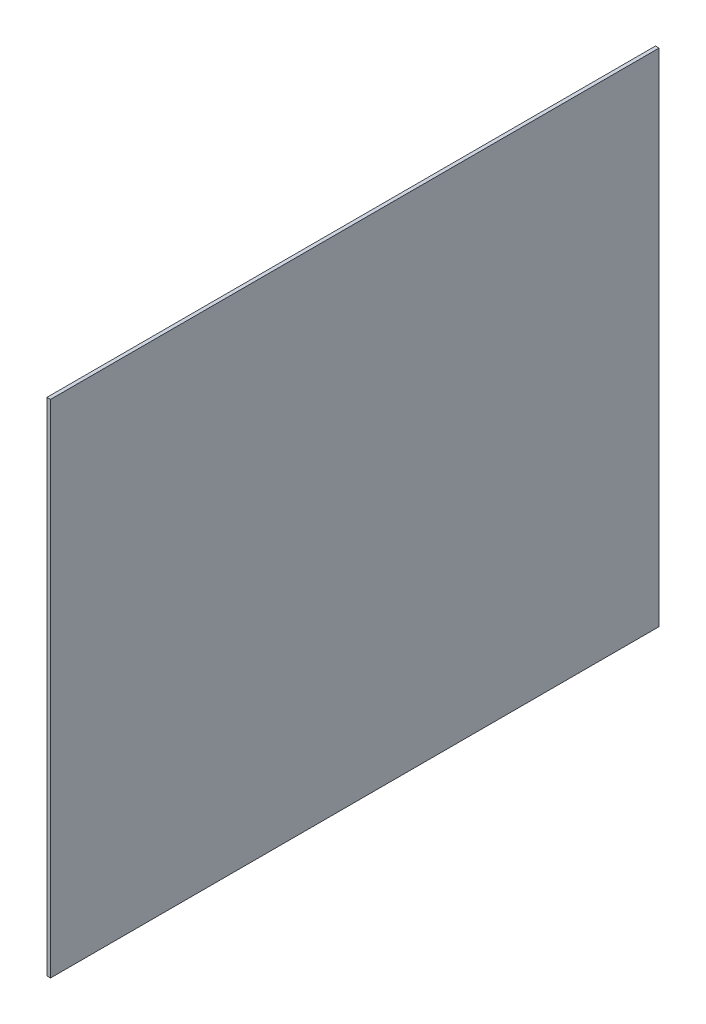
ISO-10303-21;
HEADER;
FILE_DESCRIPTION(('STEP AP214'),'2;1');
FILE_NAME('part.step','',(''),(''),'','','');
FILE_SCHEMA(('AUTOMOTIVE_DESIGN { 1 0 10303 214 1 1 1 1 }'));
ENDSEC;
DATA;
#1=APPLICATION_CONTEXT('core data for automotive mechanical design processes');
#2=APPLICATION_PROTOCOL_DEFINITION('international standard','automotive_design',2000,#1);
#3=PRODUCT_CONTEXT('',#1,'mechanical');
#4=PRODUCT('Part','Part','',(#3));
#5=PRODUCT_RELATED_PRODUCT_CATEGORY('part','',(#4));
#6=PRODUCT_DEFINITION_FORMATION('','',#4);
#7=PRODUCT_DEFINITION_CONTEXT('part definition',#1,'design');
#8=PRODUCT_DEFINITION('design','',#6,#7);
#9=PRODUCT_DEFINITION_SHAPE('','',#8);
#10=(LENGTH_UNIT() NAMED_UNIT(*) SI_UNIT(.MILLI.,.METRE.));
#11=(NAMED_UNIT(*) PLANE_ANGLE_UNIT() SI_UNIT($,.RADIAN.));
#12=(NAMED_UNIT(*) SI_UNIT($,.STERADIAN.) SOLID_ANGLE_UNIT());
#13=UNCERTAINTY_MEASURE_WITH_UNIT(LENGTH_MEASURE(1.E-05),#10,'distance_accuracy_value','');
#14=(GEOMETRIC_REPRESENTATION_CONTEXT(3) GLOBAL_UNCERTAINTY_ASSIGNED_CONTEXT((#13)) GLOBAL_UNIT_ASSIGNED_CONTEXT((#10,
#11,#12)) REPRESENTATION_CONTEXT('',''));
#15=CARTESIAN_POINT('',(0.,0.,0.));
#16=DIRECTION('',(0.,0.,1.));
#17=DIRECTION('',(1.,0.,0.));
#18=AXIS2_PLACEMENT_3D('',#15,#16,#17);
#19=CARTESIAN_POINT('',(370.,1410.,-120.));
#20=DIRECTION('',(0.,0.,1.));
#21=DIRECTION('',(0.,1.,0.));
#22=AXIS2_PLACEMENT_3D('',#19,#20,#21);
#23=PLANE('',#22);
#24=DIRECTION('',(0.,-1.,0.));
#25=VECTOR('',#24,1.);
#26=CARTESIAN_POINT('',(372.,1410.,-120.));
#27=LINE('',#26,#25);
#28=CARTESIAN_POINT('',(372.,1410.,-120.));
#29=VERTEX_POINT('',#28);
#30=CARTESIAN_POINT('',(372.,1130.,-120.));
#31=VERTEX_POINT('',#30);
#32=EDGE_CURVE('E227',#29,#31,#27,.T.);
#33=ORIENTED_EDGE('',*,*,#32,.T.);
#34=DIRECTION('',(1.,0.,0.));
#35=VECTOR('',#34,1.);
#36=CARTESIAN_POINT('',(370.,1130.,-120.));
#37=LINE('',#36,#35);
#38=CARTESIAN_POINT('',(370.,1130.,-120.));
#39=VERTEX_POINT('',#38);
#40=EDGE_CURVE('E11',#39,#31,#37,.T.);
#41=ORIENTED_EDGE('',*,*,#40,.F.);
#42=DIRECTION('',(0.,-1.,0.));
#43=VECTOR('',#42,1.);
#44=CARTESIAN_POINT('',(370.,1410.,-120.));
#45=LINE('',#44,#43);
#46=CARTESIAN_POINT('',(370.,1410.,-120.));
#47=VERTEX_POINT('',#46);
#48=EDGE_CURVE('E237',#47,#39,#45,.T.);
#49=ORIENTED_EDGE('',*,*,#48,.F.);
#50=DIRECTION('',(1.,0.,0.));
#51=VECTOR('',#50,1.);
#52=CARTESIAN_POINT('',(370.,1410.,-120.));
#53=LINE('',#52,#51);
#54=EDGE_CURVE('E246',#47,#29,#53,.T.);
#55=ORIENTED_EDGE('',*,*,#54,.T.);
#56=EDGE_LOOP('',(#33,#41,#49,#55));
#57=FACE_BOUND('',#56,.T.);
#58=ADVANCED_FACE('F17',(#57),#23,.F.);
#59=CARTESIAN_POINT('',(370.,1130.,-120.));
#60=DIRECTION('',(0.,1.,0.));
#61=DIRECTION('',(0.,0.,-1.));
#62=AXIS2_PLACEMENT_3D('',#59,#60,#61);
#63=PLANE('',#62);
#64=DIRECTION('',(0.,0.,1.));
#65=VECTOR('',#64,1.);
#66=CARTESIAN_POINT('',(372.,1130.,-120.));
#67=LINE('',#66,#65);
#68=CARTESIAN_POINT('',(372.,1130.,220.));
#69=VERTEX_POINT('',#68);
#70=EDGE_CURVE('E228',#31,#69,#67,.T.);
#71=ORIENTED_EDGE('',*,*,#70,.T.);
#72=DIRECTION('',(1.,0.,0.));
#73=VECTOR('',#72,1.);
#74=CARTESIAN_POINT('',(370.,1130.,220.));
#75=LINE('',#74,#73);
#76=CARTESIAN_POINT('',(370.,1130.,220.));
#77=VERTEX_POINT('',#76);
#78=EDGE_CURVE('E24',#77,#69,#75,.T.);
#79=ORIENTED_EDGE('',*,*,#78,.F.);
#80=DIRECTION('',(0.,0.,1.));
#81=VECTOR('',#80,1.);
#82=CARTESIAN_POINT('',(370.,1130.,-120.));
#83=LINE('',#82,#81);
#84=EDGE_CURVE('E240',#39,#77,#83,.T.);
#85=ORIENTED_EDGE('',*,*,#84,.F.);
#86=ORIENTED_EDGE('',*,*,#40,.T.);
#87=EDGE_LOOP('',(#71,#79,#85,#86));
#88=FACE_BOUND('',#87,.T.);
#89=ADVANCED_FACE('F272',(#88),#63,.F.);
#90=CARTESIAN_POINT('',(370.,1130.,220.));
#91=DIRECTION('',(0.,0.,-1.));
#92=DIRECTION('',(0.,-1.,0.));
#93=AXIS2_PLACEMENT_3D('',#90,#91,#92);
#94=PLANE('',#93);
#95=DIRECTION('',(0.,1.,0.));
#96=VECTOR('',#95,1.);
#97=CARTESIAN_POINT('',(372.,1130.,220.));
#98=LINE('',#97,#96);
#99=CARTESIAN_POINT('',(372.,1410.,220.));
#100=VERTEX_POINT('',#99);
#101=EDGE_CURVE('E233',#69,#100,#98,.T.);
#102=ORIENTED_EDGE('',*,*,#101,.T.);
#103=DIRECTION('',(1.,0.,0.));
#104=VECTOR('',#103,1.);
#105=CARTESIAN_POINT('',(370.,1410.,220.));
#106=LINE('',#105,#104);
#107=CARTESIAN_POINT('',(370.,1410.,220.));
#108=VERTEX_POINT('',#107);
#109=EDGE_CURVE('E251',#108,#100,#106,.T.);
#110=ORIENTED_EDGE('',*,*,#109,.F.);
#111=DIRECTION('',(0.,1.,0.));
#112=VECTOR('',#111,1.);
#113=CARTESIAN_POINT('',(370.,1130.,220.));
#114=LINE('',#113,#112);
#115=EDGE_CURVE('E242',#77,#108,#114,.T.);
#116=ORIENTED_EDGE('',*,*,#115,.F.);
#117=ORIENTED_EDGE('',*,*,#78,.T.);
#118=EDGE_LOOP('',(#102,#110,#116,#117));
#119=FACE_BOUND('',#118,.T.);
#120=ADVANCED_FACE('F258',(#119),#94,.F.);
#121=CARTESIAN_POINT('',(370.,1410.,220.));
#122=DIRECTION('',(0.,-1.,0.));
#123=DIRECTION('',(0.,0.,1.));
#124=AXIS2_PLACEMENT_3D('',#121,#122,#123);
#125=PLANE('',#124);
#126=DIRECTION('',(0.,0.,-1.));
#127=VECTOR('',#126,1.);
#128=CARTESIAN_POINT('',(372.,1410.,220.));
#129=LINE('',#128,#127);
#130=EDGE_CURVE('E235',#100,#29,#129,.T.);
#131=ORIENTED_EDGE('',*,*,#130,.T.);
#132=ORIENTED_EDGE('',*,*,#54,.F.);
#133=DIRECTION('',(0.,0.,-1.));
#134=VECTOR('',#133,1.);
#135=CARTESIAN_POINT('',(370.,1410.,220.));
#136=LINE('',#135,#134);
#137=EDGE_CURVE('E244',#108,#47,#136,.T.);
#138=ORIENTED_EDGE('',*,*,#137,.F.);
#139=ORIENTED_EDGE('',*,*,#109,.T.);
#140=EDGE_LOOP('',(#131,#132,#138,#139));
#141=FACE_BOUND('',#140,.T.);
#142=ADVANCED_FACE('F267',(#141),#125,.F.);
#143=CARTESIAN_POINT('',(370.,1130.,-120.));
#144=DIRECTION('',(-1.,0.,0.));
#145=DIRECTION('',(0.,-1.,0.));
#146=AXIS2_PLACEMENT_3D('',#143,#144,#145);
#147=PLANE('',#146);
#148=CARTESIAN_POINT('',(370.,1150.,-105.));
#149=CARTESIAN_POINT('',(370.,1150.,205.));
#150=B_SPLINE_CURVE_WITH_KNOTS('',1,(#148,#149),.UNSPECIFIED.,.F.,.F.,(2,2),(0.,
0.281818181818182),.UNSPECIFIED.);
#151=CARTESIAN_POINT('',(370.,1150.,-105.));
#152=VERTEX_POINT('',#151);
#153=CARTESIAN_POINT('',(370.,1150.,205.));
#154=VERTEX_POINT('',#153);
#155=EDGE_CURVE('E90',#152,#154,#150,.T.);
#156=ORIENTED_EDGE('',*,*,#155,.F.);
#157=CARTESIAN_POINT('',(370.,1385.71428571429,-105.));
#158=CARTESIAN_POINT('',(370.,1150.,-105.));
#159=B_SPLINE_CURVE_WITH_KNOTS('',1,(#157,#158),.UNSPECIFIED.,.F.,.F.,(2,2),(0.785714285714286,
1.),.UNSPECIFIED.);
#160=CARTESIAN_POINT('',(370.,1385.71428571429,-105.));
#161=VERTEX_POINT('',#160);
#162=EDGE_CURVE('E94',#161,#152,#159,.T.);
#163=ORIENTED_EDGE('',*,*,#162,.F.);
#164=CARTESIAN_POINT('',(370.,1390.,-105.));
#165=CARTESIAN_POINT('',(370.,1385.71428571429,-105.));
#166=B_SPLINE_CURVE_WITH_KNOTS('',1,(#164,#165),.UNSPECIFIED.,.F.,.F.,(2,2),(0.781818181818182,
0.785714285714286),.UNSPECIFIED.);
#167=CARTESIAN_POINT('',(370.,1390.,-105.));
#168=VERTEX_POINT('',#167);
#169=EDGE_CURVE('E115',#168,#161,#166,.T.);
#170=ORIENTED_EDGE('',*,*,#169,.F.);
#171=CARTESIAN_POINT('',(370.,1390.,205.));
#172=CARTESIAN_POINT('',(370.,1390.,-105.));
#173=B_SPLINE_CURVE_WITH_KNOTS('',1,(#171,#172),.UNSPECIFIED.,.F.,.F.,(2,2),(0.5,
0.781818181818182),.UNSPECIFIED.);
#174=CARTESIAN_POINT('',(370.,1390.,205.));
#175=VERTEX_POINT('',#174);
#176=EDGE_CURVE('E150',#175,#168,#173,.T.);
#177=ORIENTED_EDGE('',*,*,#176,.F.);
#178=CARTESIAN_POINT('',(370.,1154.28571428571,205.));
#179=CARTESIAN_POINT('',(370.,1390.,205.));
#180=B_SPLINE_CURVE_WITH_KNOTS('',1,(#178,#179),.UNSPECIFIED.,.F.,.F.,(2,2),(0.285714285714286,
0.5),.UNSPECIFIED.);
#181=CARTESIAN_POINT('',(370.,1154.28571428571,205.));
#182=VERTEX_POINT('',#181);
#183=EDGE_CURVE('E36',#182,#175,#180,.T.);
#184=ORIENTED_EDGE('',*,*,#183,.F.);
#185=CARTESIAN_POINT('',(370.,1150.,205.));
#186=CARTESIAN_POINT('',(370.,1154.28571428571,205.));
#187=B_SPLINE_CURVE_WITH_KNOTS('',1,(#185,#186),.UNSPECIFIED.,.F.,.F.,(2,2),(0.281818181818182,
0.285714285714286),.UNSPECIFIED.);
#188=EDGE_CURVE('E31',#154,#182,#187,.T.);
#189=ORIENTED_EDGE('',*,*,#188,.F.);
#190=EDGE_LOOP('',(#156,#163,#170,#177,#184,#189));
#191=FACE_BOUND('',#190,.T.);
#192=ORIENTED_EDGE('',*,*,#48,.T.);
#193=ORIENTED_EDGE('',*,*,#84,.T.);
#194=ORIENTED_EDGE('',*,*,#115,.T.);
#195=ORIENTED_EDGE('',*,*,#137,.T.);
#196=EDGE_LOOP('',(#192,#193,#194,#195));
#197=FACE_BOUND('',#196,.T.);
#198=ADVANCED_FACE('F92',(#191,#197),#147,.T.);
#199=CARTESIAN_POINT('',(372.,1130.,-120.));
#200=DIRECTION('',(-1.,0.,0.));
#201=DIRECTION('',(0.,-1.,0.));
#202=AXIS2_PLACEMENT_3D('',#199,#200,#201);
#203=PLANE('',#202);
#204=ORIENTED_EDGE('',*,*,#32,.F.);
#205=ORIENTED_EDGE('',*,*,#130,.F.);
#206=ORIENTED_EDGE('',*,*,#101,.F.);
#207=ORIENTED_EDGE('',*,*,#70,.F.);
#208=EDGE_LOOP('',(#204,#205,#206,#207));
#209=FACE_BOUND('',#208,.T.);
#210=ADVANCED_FACE('F264',(#209),#203,.F.);
#211=CARTESIAN_POINT('',(350.,1165.,48.0909090909088));
#212=DIRECTION('',(1.,0.,0.));
#213=DIRECTION('',(0.,0.,-1.));
#214=AXIS2_PLACEMENT_3D('',#211,#212,#213);
#215=PLANE('',#214);
#216=CARTESIAN_POINT('',(350.,1165.,-90.));
#217=CARTESIAN_POINT('',(350.,1165.,186.181818181818));
#218=B_SPLINE_CURVE_WITH_KNOTS('',1,(#216,#217),.UNSPECIFIED.,.F.,.F.,(2,2),(0.,
0.281818181818182),.UNSPECIFIED.);
#219=CARTESIAN_POINT('',(350.,1165.,-90.));
#220=VERTEX_POINT('',#219);
#221=CARTESIAN_POINT('',(350.,1165.,186.181818181818));
#222=VERTEX_POINT('',#221);
#223=EDGE_CURVE('E99',#220,#222,#218,.T.);
#224=ORIENTED_EDGE('',*,*,#223,.T.);
#225=CARTESIAN_POINT('',(350.,1165.,186.181818181818));
#226=CARTESIAN_POINT('',(350.,1165.,190.));
#227=B_SPLINE_CURVE_WITH_KNOTS('',1,(#225,#226),.UNSPECIFIED.,.F.,.F.,(2,2),(0.281818181818182,
0.285714285714286),.UNSPECIFIED.);
#228=CARTESIAN_POINT('',(350.,1165.,190.));
#229=VERTEX_POINT('',#228);
#230=EDGE_CURVE('E202',#222,#229,#227,.T.);
#231=ORIENTED_EDGE('',*,*,#230,.T.);
#232=CARTESIAN_POINT('',(350.,1165.,190.));
#233=CARTESIAN_POINT('',(350.,1375.,190.));
#234=B_SPLINE_CURVE_WITH_KNOTS('',1,(#232,#233),.UNSPECIFIED.,.F.,.F.,(2,2),(0.285714285714286,
0.5),.UNSPECIFIED.);
#235=CARTESIAN_POINT('',(350.,1375.,190.));
#236=VERTEX_POINT('',#235);
#237=EDGE_CURVE('E180',#229,#236,#234,.T.);
#238=ORIENTED_EDGE('',*,*,#237,.T.);
#239=CARTESIAN_POINT('',(350.,1375.,190.));
#240=CARTESIAN_POINT('',(350.,1375.,-86.1818181818184));
#241=B_SPLINE_CURVE_WITH_KNOTS('',1,(#239,#240),.UNSPECIFIED.,.F.,.F.,(2,2),(0.5,
0.781818181818182),.UNSPECIFIED.);
#242=CARTESIAN_POINT('',(350.,1375.,-86.1818181818184));
#243=VERTEX_POINT('',#242);
#244=EDGE_CURVE('E158',#236,#243,#241,.T.);
#245=ORIENTED_EDGE('',*,*,#244,.T.);
#246=CARTESIAN_POINT('',(350.,1375.,-86.1818181818184));
#247=CARTESIAN_POINT('',(350.,1375.,-90.));
#248=B_SPLINE_CURVE_WITH_KNOTS('',1,(#246,#247),.UNSPECIFIED.,.F.,.F.,(2,2),(0.781818181818182,
0.785714285714286),.UNSPECIFIED.);
#249=CARTESIAN_POINT('',(350.,1375.,-90.));
#250=VERTEX_POINT('',#249);
#251=EDGE_CURVE('E134',#243,#250,#248,.T.);
#252=ORIENTED_EDGE('',*,*,#251,.T.);
#253=CARTESIAN_POINT('',(350.,1375.,-90.));
#254=CARTESIAN_POINT('',(350.,1165.,-90.));
#255=B_SPLINE_CURVE_WITH_KNOTS('',1,(#253,#254),.UNSPECIFIED.,.F.,.F.,(2,2),(0.785714285714286,
1.),.UNSPECIFIED.);
#256=EDGE_CURVE('E110',#250,#220,#255,.T.);
#257=ORIENTED_EDGE('',*,*,#256,.T.);
#258=EDGE_LOOP('',(#224,#231,#238,#245,#252,#257));
#259=FACE_BOUND('',#258,.T.);
#260=ADVANCED_FACE('F287',(#259),#215,.F.);
#261=CARTESIAN_POINT('',(370.,1150.,-105.));
#262=CARTESIAN_POINT('',(350.,1165.,-90.));
#263=CARTESIAN_POINT('',(370.,1150.,205.));
#264=CARTESIAN_POINT('',(350.,1165.,186.181818181818));
#265=B_SPLINE_SURFACE_WITH_KNOTS('',1,1,((#261,#262),(#263,#264)),.UNSPECIFIED.,.F.,.F.,.F.,(2,
2),(2,2),(0.,0.281818181818182),(0.,1.),.UNSPECIFIED.);
#266=CARTESIAN_POINT('',(370.,1150.,205.));
#267=CARTESIAN_POINT('',(350.,1165.,186.181818181818));
#268=B_SPLINE_CURVE_WITH_KNOTS('',1,(#266,#267),.UNSPECIFIED.,.F.,.F.,(2,2),(0.,1.),.UNSPECIFIED.);
#269=EDGE_CURVE('E100',#154,#222,#268,.T.);
#270=CARTESIAN_POINT('',(370.,1150.,-105.));
#271=CARTESIAN_POINT('',(350.,1165.,-90.));
#272=B_SPLINE_CURVE_WITH_KNOTS('',1,(#270,#271),.UNSPECIFIED.,.F.,.F.,(2,2),(0.,1.),.UNSPECIFIED.);
#273=EDGE_CURVE('E105',#152,#220,#272,.T.);
#274=ORIENTED_EDGE('',*,*,#155,.T.);
#275=ORIENTED_EDGE('',*,*,#269,.T.);
#276=ORIENTED_EDGE('',*,*,#223,.F.);
#277=ORIENTED_EDGE('',*,*,#273,.F.);
#278=EDGE_LOOP('',(#274,#275,#276,#277));
#279=FACE_BOUND('',#278,.T.);
#280=ADVANCED_FACE('F112',(#279),#265,.T.);
#281=CARTESIAN_POINT('',(370.,1150.,205.));
#282=CARTESIAN_POINT('',(350.,1165.,186.181818181818));
#283=CARTESIAN_POINT('',(370.,1154.28571428571,205.));
#284=CARTESIAN_POINT('',(350.,1165.,190.));
#285=B_SPLINE_SURFACE_WITH_KNOTS('',1,1,((#281,#282),(#283,#284)),.UNSPECIFIED.,.F.,.F.,.F.,(2,
2),(2,2),(0.281818181818182,0.285714285714286),(0.,1.),.UNSPECIFIED.);
#286=CARTESIAN_POINT('',(370.,1154.28571428571,205.));
#287=CARTESIAN_POINT('',(350.,1165.,190.));
#288=B_SPLINE_CURVE_WITH_KNOTS('',1,(#286,#287),.UNSPECIFIED.,.F.,.F.,(2,2),(0.,1.),.UNSPECIFIED.);
#289=EDGE_CURVE('E188',#182,#229,#288,.T.);
#290=ORIENTED_EDGE('',*,*,#188,.T.);
#291=ORIENTED_EDGE('',*,*,#289,.T.);
#292=ORIENTED_EDGE('',*,*,#230,.F.);
#293=ORIENTED_EDGE('',*,*,#269,.F.);
#294=EDGE_LOOP('',(#290,#291,#292,#293));
#295=FACE_BOUND('',#294,.T.);
#296=ADVANCED_FACE('F295',(#295),#285,.T.);
#297=CARTESIAN_POINT('',(370.,1154.28571428571,205.));
#298=CARTESIAN_POINT('',(350.,1165.,190.));
#299=CARTESIAN_POINT('',(370.,1390.,205.));
#300=CARTESIAN_POINT('',(350.,1375.,190.));
#301=B_SPLINE_SURFACE_WITH_KNOTS('',1,1,((#297,#298),(#299,#300)),.UNSPECIFIED.,.F.,.F.,.F.,(2,
2),(2,2),(0.285714285714286,0.5),(0.,1.),.UNSPECIFIED.);
#302=CARTESIAN_POINT('',(370.,1390.,205.));
#303=CARTESIAN_POINT('',(350.,1375.,190.));
#304=B_SPLINE_CURVE_WITH_KNOTS('',1,(#302,#303),.UNSPECIFIED.,.F.,.F.,(2,2),(0.,1.),.UNSPECIFIED.);
#305=EDGE_CURVE('E166',#175,#236,#304,.T.);
#306=ORIENTED_EDGE('',*,*,#183,.T.);
#307=ORIENTED_EDGE('',*,*,#305,.T.);
#308=ORIENTED_EDGE('',*,*,#237,.F.);
#309=ORIENTED_EDGE('',*,*,#289,.F.);
#310=EDGE_LOOP('',(#306,#307,#308,#309));
#311=FACE_BOUND('',#310,.T.);
#312=ADVANCED_FACE('F305',(#311),#301,.T.);
#313=CARTESIAN_POINT('',(370.,1390.,205.));
#314=CARTESIAN_POINT('',(350.,1375.,190.));
#315=CARTESIAN_POINT('',(370.,1390.,-105.));
#316=CARTESIAN_POINT('',(350.,1375.,-86.1818181818184));
#317=B_SPLINE_SURFACE_WITH_KNOTS('',1,1,((#313,#314),(#315,#316)),.UNSPECIFIED.,.F.,.F.,.F.,(2,
2),(2,2),(0.5,0.781818181818182),(0.,1.),.UNSPECIFIED.);
#318=CARTESIAN_POINT('',(370.,1390.,-105.));
#319=CARTESIAN_POINT('',(350.,1375.,-86.1818181818184));
#320=B_SPLINE_CURVE_WITH_KNOTS('',1,(#318,#319),.UNSPECIFIED.,.F.,.F.,(2,2),(0.,1.),.UNSPECIFIED.);
#321=EDGE_CURVE('E142',#168,#243,#320,.T.);
#322=ORIENTED_EDGE('',*,*,#176,.T.);
#323=ORIENTED_EDGE('',*,*,#321,.T.);
#324=ORIENTED_EDGE('',*,*,#244,.F.);
#325=ORIENTED_EDGE('',*,*,#305,.F.);
#326=EDGE_LOOP('',(#322,#323,#324,#325));
#327=FACE_BOUND('',#326,.T.);
#328=ADVANCED_FACE('F316',(#327),#317,.T.);
#329=CARTESIAN_POINT('',(370.,1390.,-105.));
#330=CARTESIAN_POINT('',(350.,1375.,-86.1818181818184));
#331=CARTESIAN_POINT('',(370.,1385.71428571429,-105.));
#332=CARTESIAN_POINT('',(350.,1375.,-90.));
#333=B_SPLINE_SURFACE_WITH_KNOTS('',1,1,((#329,#330),(#331,#332)),.UNSPECIFIED.,.F.,.F.,.F.,(2,
2),(2,2),(0.781818181818182,0.785714285714286),(0.,1.),.UNSPECIFIED.);
#334=CARTESIAN_POINT('',(370.,1385.71428571429,-105.));
#335=CARTESIAN_POINT('',(350.,1375.,-90.));
#336=B_SPLINE_CURVE_WITH_KNOTS('',1,(#334,#335),.UNSPECIFIED.,.F.,.F.,(2,2),(0.,1.),.UNSPECIFIED.);
#337=EDGE_CURVE('E108',#161,#250,#336,.T.);
#338=ORIENTED_EDGE('',*,*,#169,.T.);
#339=ORIENTED_EDGE('',*,*,#337,.T.);
#340=ORIENTED_EDGE('',*,*,#251,.F.);
#341=ORIENTED_EDGE('',*,*,#321,.F.);
#342=EDGE_LOOP('',(#338,#339,#340,#341));
#343=FACE_BOUND('',#342,.T.);
#344=ADVANCED_FACE('F327',(#343),#333,.T.);
#345=CARTESIAN_POINT('',(370.,1385.71428571429,-105.));
#346=CARTESIAN_POINT('',(350.,1375.,-90.));
#347=CARTESIAN_POINT('',(370.,1150.,-105.));
#348=CARTESIAN_POINT('',(350.,1165.,-90.));
#349=B_SPLINE_SURFACE_WITH_KNOTS('',1,1,((#345,#346),(#347,#348)),.UNSPECIFIED.,.F.,.F.,.F.,(2,
2),(2,2),(0.785714285714286,1.),(0.,1.),.UNSPECIFIED.);
#350=ORIENTED_EDGE('',*,*,#162,.T.);
#351=ORIENTED_EDGE('',*,*,#273,.T.);
#352=ORIENTED_EDGE('',*,*,#256,.F.);
#353=ORIENTED_EDGE('',*,*,#337,.F.);
#354=EDGE_LOOP('',(#350,#351,#352,#353));
#355=FACE_BOUND('',#354,.T.);
#356=ADVANCED_FACE('F104',(#355),#349,.T.);
#357=CLOSED_SHELL('',(#58,#89,#120,#142,#198,#210,#260,#280,#296,#312,#328,#344,#356));
#358=MANIFOLD_SOLID_BREP('B1',#357);
#359=ADVANCED_BREP_SHAPE_REPRESENTATION('',(#18,#358),#14);
#360=SHAPE_DEFINITION_REPRESENTATION(#9,#359);
ENDSEC;
END-ISO-10303-21;
